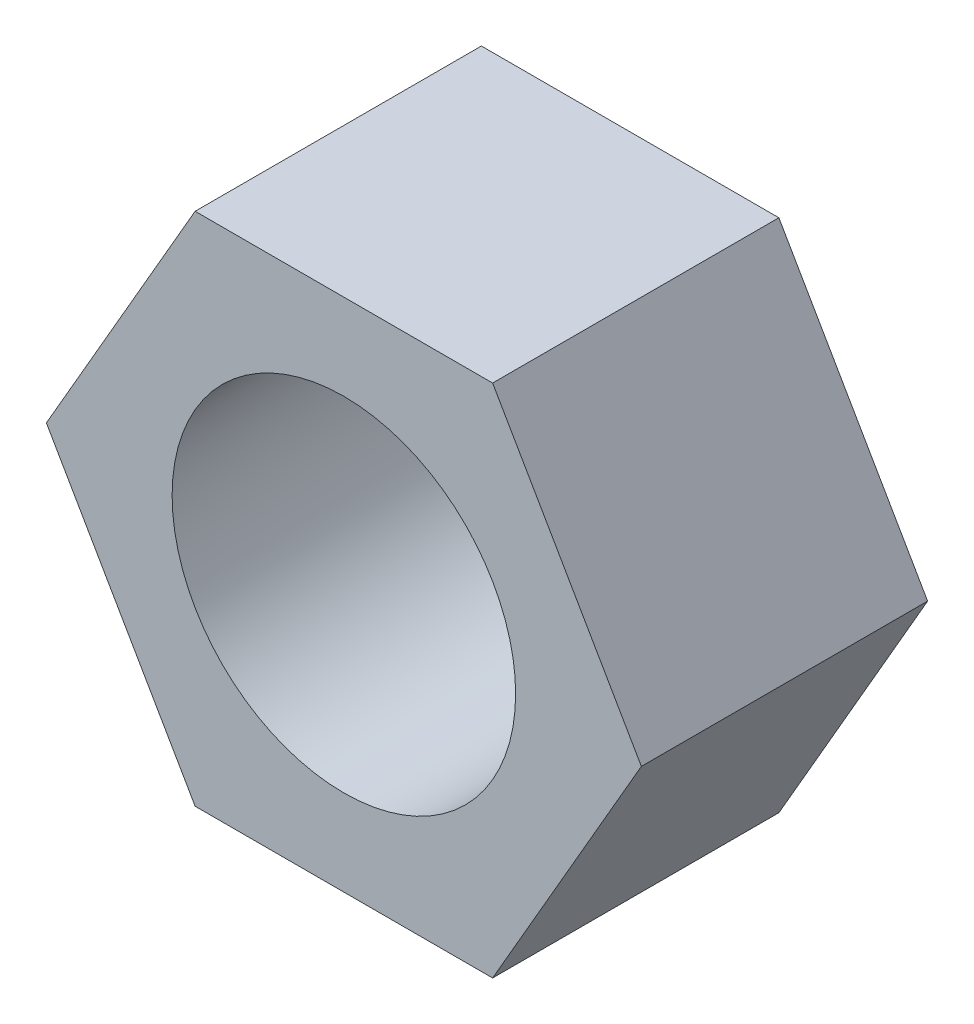
ISO-10303-21;
HEADER;
FILE_DESCRIPTION(('STEP AP214'),'2;1');
FILE_NAME('part.step','',(''),(''),'','','');
FILE_SCHEMA(('AUTOMOTIVE_DESIGN { 1 0 10303 214 1 1 1 1 }'));
ENDSEC;
DATA;
#1=APPLICATION_CONTEXT('core data for automotive mechanical design processes');
#2=APPLICATION_PROTOCOL_DEFINITION('international standard','automotive_design',2000,#1);
#3=PRODUCT_CONTEXT('',#1,'mechanical');
#4=PRODUCT('Part','Part','',(#3));
#5=PRODUCT_RELATED_PRODUCT_CATEGORY('part','',(#4));
#6=PRODUCT_DEFINITION_FORMATION('','',#4);
#7=PRODUCT_DEFINITION_CONTEXT('part definition',#1,'design');
#8=PRODUCT_DEFINITION('design','',#6,#7);
#9=PRODUCT_DEFINITION_SHAPE('','',#8);
#10=(LENGTH_UNIT() NAMED_UNIT(*) SI_UNIT(.MILLI.,.METRE.));
#11=(NAMED_UNIT(*) PLANE_ANGLE_UNIT() SI_UNIT($,.RADIAN.));
#12=(NAMED_UNIT(*) SI_UNIT($,.STERADIAN.) SOLID_ANGLE_UNIT());
#13=UNCERTAINTY_MEASURE_WITH_UNIT(LENGTH_MEASURE(1.E-05),#10,'distance_accuracy_value','');
#14=(GEOMETRIC_REPRESENTATION_CONTEXT(3) GLOBAL_UNCERTAINTY_ASSIGNED_CONTEXT((#13)) GLOBAL_UNIT_ASSIGNED_CONTEXT((#10,
#11,#12)) REPRESENTATION_CONTEXT('',''));
#15=CARTESIAN_POINT('',(0.,0.,0.));
#16=DIRECTION('',(0.,0.,1.));
#17=DIRECTION('',(1.,0.,0.));
#18=AXIS2_PLACEMENT_3D('',#15,#16,#17);
#19=CARTESIAN_POINT('',(0.,0.,5.));
#20=DIRECTION('',(0.,0.,1.));
#21=DIRECTION('',(1.,0.,0.));
#22=AXIS2_PLACEMENT_3D('',#19,#20,#21);
#23=PLANE('',#22);
#24=DIRECTION('',(1.,0.,0.));
#25=VECTOR('',#24,1.);
#26=CARTESIAN_POINT('',(-2.59807621135332,-4.5,5.));
#27=LINE('',#26,#25);
#28=CARTESIAN_POINT('',(-2.59807621135332,-4.5,5.));
#29=VERTEX_POINT('',#28);
#30=CARTESIAN_POINT('',(2.59807621135332,-4.5,5.));
#31=VERTEX_POINT('',#30);
#32=EDGE_CURVE('E133',#29,#31,#27,.T.);
#33=ORIENTED_EDGE('',*,*,#32,.T.);
#34=DIRECTION('',(0.5,0.866025403784439,0.));
#35=VECTOR('',#34,1.);
#36=CARTESIAN_POINT('',(2.59807621135332,-4.5,5.));
#37=LINE('',#36,#35);
#38=CARTESIAN_POINT('',(5.19615242270663,0.,5.));
#39=VERTEX_POINT('',#38);
#40=EDGE_CURVE('E91',#31,#39,#37,.T.);
#41=ORIENTED_EDGE('',*,*,#40,.T.);
#42=DIRECTION('',(-0.5,0.866025403784438,0.));
#43=VECTOR('',#42,1.);
#44=CARTESIAN_POINT('',(5.19615242270663,0.,5.));
#45=LINE('',#44,#43);
#46=CARTESIAN_POINT('',(2.59807621135332,4.5,5.));
#47=VERTEX_POINT('',#46);
#48=EDGE_CURVE('E104',#39,#47,#45,.T.);
#49=ORIENTED_EDGE('',*,*,#48,.T.);
#50=DIRECTION('',(-1.,0.,0.));
#51=VECTOR('',#50,1.);
#52=CARTESIAN_POINT('',(2.59807621135332,4.5,5.));
#53=LINE('',#52,#51);
#54=CARTESIAN_POINT('',(-2.59807621135332,4.5,5.));
#55=VERTEX_POINT('',#54);
#56=EDGE_CURVE('E98',#47,#55,#53,.T.);
#57=ORIENTED_EDGE('',*,*,#56,.T.);
#58=DIRECTION('',(-0.5,-0.866025403784439,0.));
#59=VECTOR('',#58,1.);
#60=CARTESIAN_POINT('',(-2.59807621135332,4.5,5.));
#61=LINE('',#60,#59);
#62=CARTESIAN_POINT('',(-5.19615242270663,0.,5.));
#63=VERTEX_POINT('',#62);
#64=EDGE_CURVE('E102',#55,#63,#61,.T.);
#65=ORIENTED_EDGE('',*,*,#64,.T.);
#66=DIRECTION('',(0.5,-0.866025403784439,0.));
#67=VECTOR('',#66,1.);
#68=CARTESIAN_POINT('',(-5.19615242270663,0.,5.));
#69=LINE('',#68,#67);
#70=EDGE_CURVE('E54',#63,#29,#69,.T.);
#71=ORIENTED_EDGE('',*,*,#70,.T.);
#72=EDGE_LOOP('',(#33,#41,#49,#57,#65,#71));
#73=FACE_BOUND('',#72,.T.);
#74=CARTESIAN_POINT('',(0.,0.,5.));
#75=DIRECTION('',(0.,0.,1.));
#76=DIRECTION('',(1.,0.,0.));
#77=AXIS2_PLACEMENT_3D('',#74,#75,#76);
#78=CIRCLE('',#77,3.);
#79=CARTESIAN_POINT('',(3.,0.,5.));
#80=VERTEX_POINT('',#79);
#81=EDGE_CURVE('E126',#80,#80,#78,.T.);
#82=ORIENTED_EDGE('',*,*,#81,.F.);
#83=EDGE_LOOP('',(#82));
#84=FACE_BOUND('',#83,.T.);
#85=ADVANCED_FACE('F37',(#73,#84),#23,.T.);
#86=CARTESIAN_POINT('',(0.,0.,0.));
#87=DIRECTION('',(0.,0.,1.));
#88=DIRECTION('',(1.,0.,0.));
#89=AXIS2_PLACEMENT_3D('',#86,#87,#88);
#90=PLANE('',#89);
#91=DIRECTION('',(1.,0.,0.));
#92=VECTOR('',#91,1.);
#93=CARTESIAN_POINT('',(-2.59807621135332,-4.5,0.));
#94=LINE('',#93,#92);
#95=CARTESIAN_POINT('',(-2.59807621135332,-4.5,0.));
#96=VERTEX_POINT('',#95);
#97=CARTESIAN_POINT('',(2.59807621135332,-4.5,0.));
#98=VERTEX_POINT('',#97);
#99=EDGE_CURVE('E122',#96,#98,#94,.T.);
#100=ORIENTED_EDGE('',*,*,#99,.F.);
#101=DIRECTION('',(0.5,-0.866025403784439,0.));
#102=VECTOR('',#101,1.);
#103=CARTESIAN_POINT('',(-5.19615242270663,0.,0.));
#104=LINE('',#103,#102);
#105=CARTESIAN_POINT('',(-5.19615242270663,0.,0.));
#106=VERTEX_POINT('',#105);
#107=EDGE_CURVE('E83',#106,#96,#104,.T.);
#108=ORIENTED_EDGE('',*,*,#107,.F.);
#109=DIRECTION('',(-0.5,-0.866025403784439,0.));
#110=VECTOR('',#109,1.);
#111=CARTESIAN_POINT('',(-2.59807621135332,4.5,0.));
#112=LINE('',#111,#110);
#113=CARTESIAN_POINT('',(-2.59807621135332,4.5,0.));
#114=VERTEX_POINT('',#113);
#115=EDGE_CURVE('E77',#114,#106,#112,.T.);
#116=ORIENTED_EDGE('',*,*,#115,.F.);
#117=DIRECTION('',(-1.,0.,0.));
#118=VECTOR('',#117,1.);
#119=CARTESIAN_POINT('',(2.59807621135332,4.5,0.));
#120=LINE('',#119,#118);
#121=CARTESIAN_POINT('',(2.59807621135332,4.5,0.));
#122=VERTEX_POINT('',#121);
#123=EDGE_CURVE('E112',#122,#114,#120,.T.);
#124=ORIENTED_EDGE('',*,*,#123,.F.);
#125=DIRECTION('',(-0.5,0.866025403784438,0.));
#126=VECTOR('',#125,1.);
#127=CARTESIAN_POINT('',(5.19615242270663,0.,0.));
#128=LINE('',#127,#126);
#129=CARTESIAN_POINT('',(5.19615242270663,0.,0.));
#130=VERTEX_POINT('',#129);
#131=EDGE_CURVE('E128',#130,#122,#128,.T.);
#132=ORIENTED_EDGE('',*,*,#131,.F.);
#133=DIRECTION('',(0.5,0.866025403784439,0.));
#134=VECTOR('',#133,1.);
#135=CARTESIAN_POINT('',(2.59807621135332,-4.5,0.));
#136=LINE('',#135,#134);
#137=EDGE_CURVE('E125',#98,#130,#136,.T.);
#138=ORIENTED_EDGE('',*,*,#137,.F.);
#139=EDGE_LOOP('',(#100,#108,#116,#124,#132,#138));
#140=FACE_BOUND('',#139,.T.);
#141=CARTESIAN_POINT('',(0.,0.,0.));
#142=DIRECTION('',(0.,0.,1.));
#143=DIRECTION('',(1.,0.,0.));
#144=AXIS2_PLACEMENT_3D('',#141,#142,#143);
#145=CIRCLE('',#144,3.);
#146=CARTESIAN_POINT('',(3.,0.,0.));
#147=VERTEX_POINT('',#146);
#148=EDGE_CURVE('E244',#147,#147,#145,.T.);
#149=ORIENTED_EDGE('',*,*,#148,.T.);
#150=EDGE_LOOP('',(#149));
#151=FACE_BOUND('',#150,.T.);
#152=ADVANCED_FACE('F142',(#140,#151),#90,.F.);
#153=CARTESIAN_POINT('',(-2.59807621135332,-4.5,5.));
#154=DIRECTION('',(0.,1.,0.));
#155=DIRECTION('',(0.,0.,1.));
#156=AXIS2_PLACEMENT_3D('',#153,#154,#155);
#157=PLANE('',#156);
#158=ORIENTED_EDGE('',*,*,#99,.T.);
#159=DIRECTION('',(0.,0.,-1.));
#160=VECTOR('',#159,1.);
#161=CARTESIAN_POINT('',(2.59807621135332,-4.5,5.));
#162=LINE('',#161,#160);
#163=EDGE_CURVE('E11',#31,#98,#162,.T.);
#164=ORIENTED_EDGE('',*,*,#163,.F.);
#165=ORIENTED_EDGE('',*,*,#32,.F.);
#166=DIRECTION('',(0.,0.,-1.));
#167=VECTOR('',#166,1.);
#168=CARTESIAN_POINT('',(-2.59807621135332,-4.5,5.));
#169=LINE('',#168,#167);
#170=EDGE_CURVE('E118',#29,#96,#169,.T.);
#171=ORIENTED_EDGE('',*,*,#170,.T.);
#172=EDGE_LOOP('',(#158,#164,#165,#171));
#173=FACE_BOUND('',#172,.T.);
#174=ADVANCED_FACE('F39',(#173),#157,.F.);
#175=CARTESIAN_POINT('',(2.59807621135332,-4.5,5.));
#176=DIRECTION('',(-0.866025403784438,0.5,0.));
#177=DIRECTION('',(-0.5,-0.866025403784439,0.));
#178=AXIS2_PLACEMENT_3D('',#175,#176,#177);
#179=PLANE('',#178);
#180=ORIENTED_EDGE('',*,*,#137,.T.);
#181=DIRECTION('',(0.,0.,-1.));
#182=VECTOR('',#181,1.);
#183=CARTESIAN_POINT('',(5.19615242270663,0.,5.));
#184=LINE('',#183,#182);
#185=EDGE_CURVE('E46',#39,#130,#184,.T.);
#186=ORIENTED_EDGE('',*,*,#185,.F.);
#187=ORIENTED_EDGE('',*,*,#40,.F.);
#188=ORIENTED_EDGE('',*,*,#163,.T.);
#189=EDGE_LOOP('',(#180,#186,#187,#188));
#190=FACE_BOUND('',#189,.T.);
#191=ADVANCED_FACE('F167',(#190),#179,.F.);
#192=CARTESIAN_POINT('',(5.19615242270663,0.,5.));
#193=DIRECTION('',(-0.866025403784438,-0.5,0.));
#194=DIRECTION('',(0.5,-0.866025403784439,0.));
#195=AXIS2_PLACEMENT_3D('',#192,#193,#194);
#196=PLANE('',#195);
#197=ORIENTED_EDGE('',*,*,#131,.T.);
#198=DIRECTION('',(0.,0.,-1.));
#199=VECTOR('',#198,1.);
#200=CARTESIAN_POINT('',(2.59807621135332,4.5,5.));
#201=LINE('',#200,#199);
#202=EDGE_CURVE('E113',#47,#122,#201,.T.);
#203=ORIENTED_EDGE('',*,*,#202,.F.);
#204=ORIENTED_EDGE('',*,*,#48,.F.);
#205=ORIENTED_EDGE('',*,*,#185,.T.);
#206=EDGE_LOOP('',(#197,#203,#204,#205));
#207=FACE_BOUND('',#206,.T.);
#208=ADVANCED_FACE('F139',(#207),#196,.F.);
#209=CARTESIAN_POINT('',(2.59807621135332,4.5,5.));
#210=DIRECTION('',(0.,-1.,0.));
#211=DIRECTION('',(1.,0.,0.));
#212=AXIS2_PLACEMENT_3D('',#209,#210,#211);
#213=PLANE('',#212);
#214=ORIENTED_EDGE('',*,*,#123,.T.);
#215=DIRECTION('',(0.,0.,-1.));
#216=VECTOR('',#215,1.);
#217=CARTESIAN_POINT('',(-2.59807621135332,4.5,5.));
#218=LINE('',#217,#216);
#219=EDGE_CURVE('E109',#55,#114,#218,.T.);
#220=ORIENTED_EDGE('',*,*,#219,.F.);
#221=ORIENTED_EDGE('',*,*,#56,.F.);
#222=ORIENTED_EDGE('',*,*,#202,.T.);
#223=EDGE_LOOP('',(#214,#220,#221,#222));
#224=FACE_BOUND('',#223,.T.);
#225=ADVANCED_FACE('F110',(#224),#213,.F.);
#226=CARTESIAN_POINT('',(-2.59807621135332,4.5,5.));
#227=DIRECTION('',(0.866025403784439,-0.5,0.));
#228=DIRECTION('',(0.5,0.866025403784439,0.));
#229=AXIS2_PLACEMENT_3D('',#226,#227,#228);
#230=PLANE('',#229);
#231=ORIENTED_EDGE('',*,*,#115,.T.);
#232=DIRECTION('',(0.,0.,-1.));
#233=VECTOR('',#232,1.);
#234=CARTESIAN_POINT('',(-5.19615242270663,0.,5.));
#235=LINE('',#234,#233);
#236=EDGE_CURVE('E114',#63,#106,#235,.T.);
#237=ORIENTED_EDGE('',*,*,#236,.F.);
#238=ORIENTED_EDGE('',*,*,#64,.F.);
#239=ORIENTED_EDGE('',*,*,#219,.T.);
#240=EDGE_LOOP('',(#231,#237,#238,#239));
#241=FACE_BOUND('',#240,.T.);
#242=ADVANCED_FACE('F116',(#241),#230,.F.);
#243=CARTESIAN_POINT('',(-5.19615242270663,0.,5.));
#244=DIRECTION('',(0.866025403784439,0.5,0.));
#245=DIRECTION('',(-0.5,0.866025403784439,0.));
#246=AXIS2_PLACEMENT_3D('',#243,#244,#245);
#247=PLANE('',#246);
#248=ORIENTED_EDGE('',*,*,#107,.T.);
#249=ORIENTED_EDGE('',*,*,#170,.F.);
#250=ORIENTED_EDGE('',*,*,#70,.F.);
#251=ORIENTED_EDGE('',*,*,#236,.T.);
#252=EDGE_LOOP('',(#248,#249,#250,#251));
#253=FACE_BOUND('',#252,.T.);
#254=ADVANCED_FACE('F147',(#253),#247,.F.);
#255=CARTESIAN_POINT('',(0.,0.,5.));
#256=DIRECTION('',(0.,0.,-1.));
#257=DIRECTION('',(-1.,0.,0.));
#258=AXIS2_PLACEMENT_3D('',#255,#256,#257);
#259=CYLINDRICAL_SURFACE('',#258,3.);
#260=ORIENTED_EDGE('',*,*,#81,.T.);
#261=EDGE_LOOP('',(#260));
#262=FACE_BOUND('',#261,.T.);
#263=ORIENTED_EDGE('',*,*,#148,.F.);
#264=EDGE_LOOP('',(#263));
#265=FACE_BOUND('',#264,.T.);
#266=ADVANCED_FACE('F149',(#262,#265),#259,.F.);
#267=CLOSED_SHELL('',(#85,#152,#174,#191,#208,#225,#242,#254,#266));
#268=MANIFOLD_SOLID_BREP('B2',#267);
#269=ADVANCED_BREP_SHAPE_REPRESENTATION('',(#18,#268),#14);
#270=SHAPE_DEFINITION_REPRESENTATION(#9,#269);
ENDSEC;
END-ISO-10303-21;
